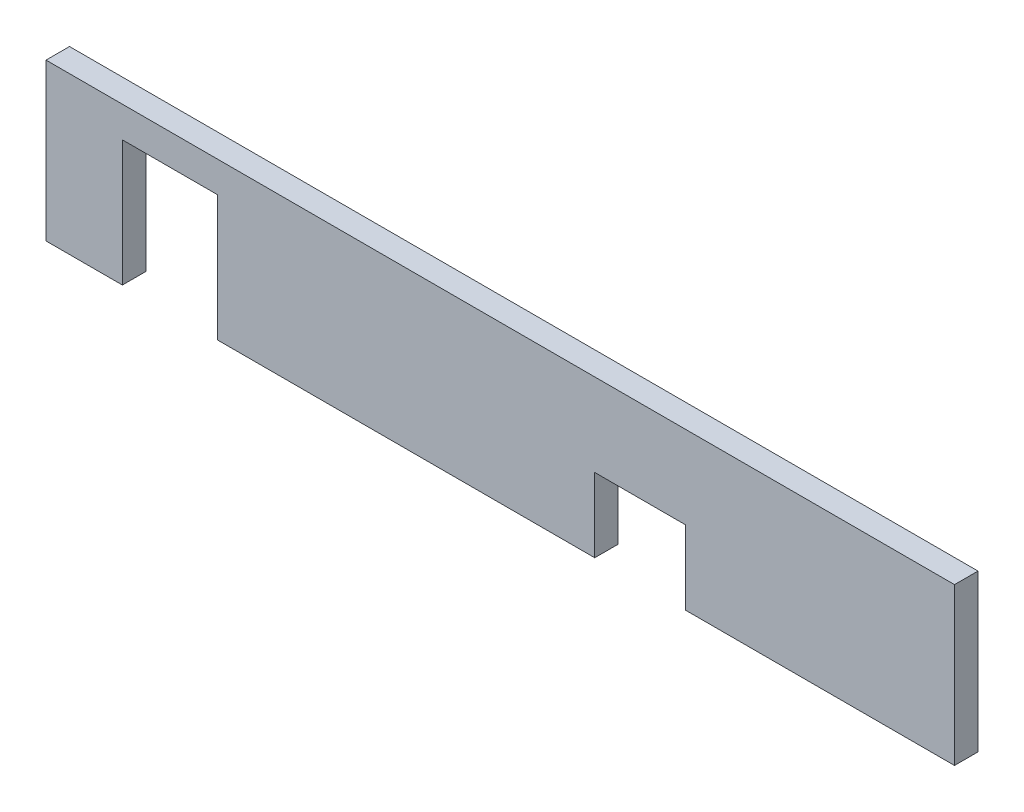
ISO-10303-21;
HEADER;
FILE_DESCRIPTION(('STEP AP214'),'2;1');
FILE_NAME('part.step','',(''),(''),'','','');
FILE_SCHEMA(('AUTOMOTIVE_DESIGN { 1 0 10303 214 1 1 1 1 }'));
ENDSEC;
DATA;
#1=APPLICATION_CONTEXT('core data for automotive mechanical design processes');
#2=APPLICATION_PROTOCOL_DEFINITION('international standard','automotive_design',2000,#1);
#3=PRODUCT_CONTEXT('',#1,'mechanical');
#4=PRODUCT('Part','Part','',(#3));
#5=PRODUCT_RELATED_PRODUCT_CATEGORY('part','',(#4));
#6=PRODUCT_DEFINITION_FORMATION('','',#4);
#7=PRODUCT_DEFINITION_CONTEXT('part definition',#1,'design');
#8=PRODUCT_DEFINITION('design','',#6,#7);
#9=PRODUCT_DEFINITION_SHAPE('','',#8);
#10=(LENGTH_UNIT() NAMED_UNIT(*) SI_UNIT(.MILLI.,.METRE.));
#11=(NAMED_UNIT(*) PLANE_ANGLE_UNIT() SI_UNIT($,.RADIAN.));
#12=(NAMED_UNIT(*) SI_UNIT($,.STERADIAN.) SOLID_ANGLE_UNIT());
#13=UNCERTAINTY_MEASURE_WITH_UNIT(LENGTH_MEASURE(1.E-05),#10,'distance_accuracy_value','');
#14=(GEOMETRIC_REPRESENTATION_CONTEXT(3) GLOBAL_UNCERTAINTY_ASSIGNED_CONTEXT((#13)) GLOBAL_UNIT_ASSIGNED_CONTEXT((#10,
#11,#12)) REPRESENTATION_CONTEXT('',''));
#15=CARTESIAN_POINT('',(0.,0.,0.));
#16=DIRECTION('',(0.,0.,1.));
#17=DIRECTION('',(1.,0.,0.));
#18=AXIS2_PLACEMENT_3D('',#15,#16,#17);
#19=CARTESIAN_POINT('',(0.,0.,3.));
#20=DIRECTION('',(1.,0.,0.));
#21=DIRECTION('',(0.,0.,-1.));
#22=AXIS2_PLACEMENT_3D('',#19,#20,#21);
#23=PLANE('',#22);
#24=DIRECTION('',(0.,-1.,0.));
#25=VECTOR('',#24,1.);
#26=CARTESIAN_POINT('',(0.,0.,0.));
#27=LINE('',#26,#25);
#28=CARTESIAN_POINT('',(0.,20.,0.));
#29=VERTEX_POINT('',#28);
#30=CARTESIAN_POINT('',(0.,0.,0.));
#31=VERTEX_POINT('',#30);
#32=EDGE_CURVE('E153',#29,#31,#27,.T.);
#33=ORIENTED_EDGE('',*,*,#32,.T.);
#34=DIRECTION('',(0.,0.,-1.));
#35=VECTOR('',#34,1.);
#36=CARTESIAN_POINT('',(0.,0.,3.));
#37=LINE('',#36,#35);
#38=CARTESIAN_POINT('',(0.,0.,3.));
#39=VERTEX_POINT('',#38);
#40=EDGE_CURVE('E11',#39,#31,#37,.T.);
#41=ORIENTED_EDGE('',*,*,#40,.F.);
#42=DIRECTION('',(0.,-1.,0.));
#43=VECTOR('',#42,1.);
#44=CARTESIAN_POINT('',(0.,0.,3.));
#45=LINE('',#44,#43);
#46=CARTESIAN_POINT('',(0.,20.,3.));
#47=VERTEX_POINT('',#46);
#48=EDGE_CURVE('E175',#47,#39,#45,.T.);
#49=ORIENTED_EDGE('',*,*,#48,.F.);
#50=DIRECTION('',(0.,0.,-1.));
#51=VECTOR('',#50,1.);
#52=CARTESIAN_POINT('',(0.,20.,3.));
#53=LINE('',#52,#51);
#54=EDGE_CURVE('E149',#47,#29,#53,.T.);
#55=ORIENTED_EDGE('',*,*,#54,.T.);
#56=EDGE_LOOP('',(#33,#41,#49,#55));
#57=FACE_BOUND('',#56,.T.);
#58=ADVANCED_FACE('F33',(#57),#23,.F.);
#59=CARTESIAN_POINT('',(0.,0.,3.));
#60=DIRECTION('',(0.,1.,0.));
#61=DIRECTION('',(0.,0.,1.));
#62=AXIS2_PLACEMENT_3D('',#59,#60,#61);
#63=PLANE('',#62);
#64=DIRECTION('',(1.,0.,0.));
#65=VECTOR('',#64,1.);
#66=CARTESIAN_POINT('',(0.,0.,0.));
#67=LINE('',#66,#65);
#68=CARTESIAN_POINT('',(9.75317906025808,0.,0.));
#69=VERTEX_POINT('',#68);
#70=EDGE_CURVE('E156',#31,#69,#67,.T.);
#71=ORIENTED_EDGE('',*,*,#70,.T.);
#72=DIRECTION('',(0.,0.,-1.));
#73=VECTOR('',#72,1.);
#74=CARTESIAN_POINT('',(9.75317906025808,0.,3.));
#75=LINE('',#74,#73);
#76=CARTESIAN_POINT('',(9.75317906025808,0.,3.));
#77=VERTEX_POINT('',#76);
#78=EDGE_CURVE('E41',#77,#69,#75,.T.);
#79=ORIENTED_EDGE('',*,*,#78,.F.);
#80=DIRECTION('',(1.,0.,0.));
#81=VECTOR('',#80,1.);
#82=CARTESIAN_POINT('',(0.,0.,3.));
#83=LINE('',#82,#81);
#84=EDGE_CURVE('E104',#39,#77,#83,.T.);
#85=ORIENTED_EDGE('',*,*,#84,.F.);
#86=ORIENTED_EDGE('',*,*,#40,.T.);
#87=EDGE_LOOP('',(#71,#79,#85,#86));
#88=FACE_BOUND('',#87,.T.);
#89=ADVANCED_FACE('F253',(#88),#63,.F.);
#90=CARTESIAN_POINT('',(9.75317906025808,0.,3.));
#91=DIRECTION('',(-1.,0.,0.));
#92=DIRECTION('',(0.,0.,1.));
#93=AXIS2_PLACEMENT_3D('',#90,#91,#92);
#94=PLANE('',#93);
#95=DIRECTION('',(0.,1.,0.));
#96=VECTOR('',#95,1.);
#97=CARTESIAN_POINT('',(9.75317906025808,0.,0.));
#98=LINE('',#97,#96);
#99=CARTESIAN_POINT('',(9.75317906025808,16.0609501018403,0.));
#100=VERTEX_POINT('',#99);
#101=EDGE_CURVE('E158',#69,#100,#98,.T.);
#102=ORIENTED_EDGE('',*,*,#101,.T.);
#103=DIRECTION('',(0.,0.,-1.));
#104=VECTOR('',#103,1.);
#105=CARTESIAN_POINT('',(9.75317906025808,16.0609501018403,3.));
#106=LINE('',#105,#104);
#107=CARTESIAN_POINT('',(9.75317906025808,16.0609501018403,3.));
#108=VERTEX_POINT('',#107);
#109=EDGE_CURVE('E194',#108,#100,#106,.T.);
#110=ORIENTED_EDGE('',*,*,#109,.F.);
#111=DIRECTION('',(0.,1.,0.));
#112=VECTOR('',#111,1.);
#113=CARTESIAN_POINT('',(9.75317906025808,0.,3.));
#114=LINE('',#113,#112);
#115=EDGE_CURVE('E202',#77,#108,#114,.T.);
#116=ORIENTED_EDGE('',*,*,#115,.F.);
#117=ORIENTED_EDGE('',*,*,#78,.T.);
#118=EDGE_LOOP('',(#102,#110,#116,#117));
#119=FACE_BOUND('',#118,.T.);
#120=ADVANCED_FACE('F200',(#119),#94,.F.);
#121=CARTESIAN_POINT('',(9.75317906025808,16.0609501018403,3.));
#122=DIRECTION('',(0.,1.,0.));
#123=DIRECTION('',(0.,0.,1.));
#124=AXIS2_PLACEMENT_3D('',#121,#122,#123);
#125=PLANE('',#124);
#126=DIRECTION('',(1.,0.,0.));
#127=VECTOR('',#126,1.);
#128=CARTESIAN_POINT('',(9.75317906025808,16.0609501018403,0.));
#129=LINE('',#128,#127);
#130=CARTESIAN_POINT('',(21.8848327683077,16.0609501018403,0.));
#131=VERTEX_POINT('',#130);
#132=EDGE_CURVE('E160',#100,#131,#129,.T.);
#133=ORIENTED_EDGE('',*,*,#132,.T.);
#134=DIRECTION('',(0.,0.,-1.));
#135=VECTOR('',#134,1.);
#136=CARTESIAN_POINT('',(21.8848327683077,16.0609501018403,3.));
#137=LINE('',#136,#135);
#138=CARTESIAN_POINT('',(21.8848327683077,16.0609501018403,3.));
#139=VERTEX_POINT('',#138);
#140=EDGE_CURVE('E191',#139,#131,#137,.T.);
#141=ORIENTED_EDGE('',*,*,#140,.F.);
#142=DIRECTION('',(1.,0.,0.));
#143=VECTOR('',#142,1.);
#144=CARTESIAN_POINT('',(9.75317906025808,16.0609501018403,3.));
#145=LINE('',#144,#143);
#146=EDGE_CURVE('E220',#108,#139,#145,.T.);
#147=ORIENTED_EDGE('',*,*,#146,.F.);
#148=ORIENTED_EDGE('',*,*,#109,.T.);
#149=EDGE_LOOP('',(#133,#141,#147,#148));
#150=FACE_BOUND('',#149,.T.);
#151=ADVANCED_FACE('F211',(#150),#125,.F.);
#152=CARTESIAN_POINT('',(21.8848327683077,16.0609501018403,3.));
#153=DIRECTION('',(1.,0.,0.));
#154=DIRECTION('',(0.,1.,0.));
#155=AXIS2_PLACEMENT_3D('',#152,#153,#154);
#156=PLANE('',#155);
#157=DIRECTION('',(0.,-1.,0.));
#158=VECTOR('',#157,1.);
#159=CARTESIAN_POINT('',(21.8848327683077,16.0609501018403,0.));
#160=LINE('',#159,#158);
#161=CARTESIAN_POINT('',(21.8848327683077,0.,0.));
#162=VERTEX_POINT('',#161);
#163=EDGE_CURVE('E162',#131,#162,#160,.T.);
#164=ORIENTED_EDGE('',*,*,#163,.T.);
#165=DIRECTION('',(0.,0.,-1.));
#166=VECTOR('',#165,1.);
#167=CARTESIAN_POINT('',(21.8848327683077,0.,3.));
#168=LINE('',#167,#166);
#169=CARTESIAN_POINT('',(21.8848327683077,0.,3.));
#170=VERTEX_POINT('',#169);
#171=EDGE_CURVE('E188',#170,#162,#168,.T.);
#172=ORIENTED_EDGE('',*,*,#171,.F.);
#173=DIRECTION('',(0.,-1.,0.));
#174=VECTOR('',#173,1.);
#175=CARTESIAN_POINT('',(21.8848327683077,16.0609501018403,3.));
#176=LINE('',#175,#174);
#177=EDGE_CURVE('E217',#139,#170,#176,.T.);
#178=ORIENTED_EDGE('',*,*,#177,.F.);
#179=ORIENTED_EDGE('',*,*,#140,.T.);
#180=EDGE_LOOP('',(#164,#172,#178,#179));
#181=FACE_BOUND('',#180,.T.);
#182=ADVANCED_FACE('F215',(#181),#156,.F.);
#183=CARTESIAN_POINT('',(21.8848327683077,0.,3.));
#184=DIRECTION('',(0.,1.,0.));
#185=DIRECTION('',(0.,0.,1.));
#186=AXIS2_PLACEMENT_3D('',#183,#184,#185);
#187=PLANE('',#186);
#188=DIRECTION('',(1.,0.,0.));
#189=VECTOR('',#188,1.);
#190=CARTESIAN_POINT('',(21.8848327683077,0.,0.));
#191=LINE('',#190,#189);
#192=CARTESIAN_POINT('',(70.0646891029635,0.,0.));
#193=VERTEX_POINT('',#192);
#194=EDGE_CURVE('E164',#162,#193,#191,.T.);
#195=ORIENTED_EDGE('',*,*,#194,.T.);
#196=DIRECTION('',(0.,0.,-1.));
#197=VECTOR('',#196,1.);
#198=CARTESIAN_POINT('',(70.0646891029635,0.,3.));
#199=LINE('',#198,#197);
#200=CARTESIAN_POINT('',(70.0646891029635,0.,3.));
#201=VERTEX_POINT('',#200);
#202=EDGE_CURVE('E185',#201,#193,#199,.T.);
#203=ORIENTED_EDGE('',*,*,#202,.F.);
#204=DIRECTION('',(1.,0.,0.));
#205=VECTOR('',#204,1.);
#206=CARTESIAN_POINT('',(21.8848327683077,0.,3.));
#207=LINE('',#206,#205);
#208=EDGE_CURVE('E219',#170,#201,#207,.T.);
#209=ORIENTED_EDGE('',*,*,#208,.F.);
#210=ORIENTED_EDGE('',*,*,#171,.T.);
#211=EDGE_LOOP('',(#195,#203,#209,#210));
#212=FACE_BOUND('',#211,.T.);
#213=ADVANCED_FACE('F266',(#212),#187,.F.);
#214=CARTESIAN_POINT('',(70.0646891029635,0.,3.));
#215=DIRECTION('',(-1.,0.,0.));
#216=DIRECTION('',(0.,0.,1.));
#217=AXIS2_PLACEMENT_3D('',#214,#215,#216);
#218=PLANE('',#217);
#219=DIRECTION('',(0.,1.,0.));
#220=VECTOR('',#219,1.);
#221=CARTESIAN_POINT('',(70.0646891029635,0.,0.));
#222=LINE('',#221,#220);
#223=CARTESIAN_POINT('',(70.0646891029635,9.43656537863546,0.));
#224=VERTEX_POINT('',#223);
#225=EDGE_CURVE('E166',#193,#224,#222,.T.);
#226=ORIENTED_EDGE('',*,*,#225,.T.);
#227=DIRECTION('',(0.,0.,-1.));
#228=VECTOR('',#227,1.);
#229=CARTESIAN_POINT('',(70.0646891029635,9.43656537863546,3.));
#230=LINE('',#229,#228);
#231=CARTESIAN_POINT('',(70.0646891029635,9.43656537863546,3.));
#232=VERTEX_POINT('',#231);
#233=EDGE_CURVE('E182',#232,#224,#230,.T.);
#234=ORIENTED_EDGE('',*,*,#233,.F.);
#235=DIRECTION('',(0.,1.,0.));
#236=VECTOR('',#235,1.);
#237=CARTESIAN_POINT('',(70.0646891029635,0.,3.));
#238=LINE('',#237,#236);
#239=EDGE_CURVE('E222',#201,#232,#238,.T.);
#240=ORIENTED_EDGE('',*,*,#239,.F.);
#241=ORIENTED_EDGE('',*,*,#202,.T.);
#242=EDGE_LOOP('',(#226,#234,#240,#241));
#243=FACE_BOUND('',#242,.T.);
#244=ADVANCED_FACE('F269',(#243),#218,.F.);
#245=CARTESIAN_POINT('',(70.0646891029635,9.43656537863546,3.));
#246=DIRECTION('',(0.,1.,0.));
#247=DIRECTION('',(0.,0.,1.));
#248=AXIS2_PLACEMENT_3D('',#245,#246,#247);
#249=PLANE('',#248);
#250=DIRECTION('',(1.,0.,0.));
#251=VECTOR('',#250,1.);
#252=CARTESIAN_POINT('',(70.0646891029635,9.43656537863546,0.));
#253=LINE('',#252,#251);
#254=CARTESIAN_POINT('',(81.6215854878806,9.43656537863546,0.));
#255=VERTEX_POINT('',#254);
#256=EDGE_CURVE('E168',#224,#255,#253,.T.);
#257=ORIENTED_EDGE('',*,*,#256,.T.);
#258=DIRECTION('',(0.,0.,-1.));
#259=VECTOR('',#258,1.);
#260=CARTESIAN_POINT('',(81.6215854878806,9.43656537863546,3.));
#261=LINE('',#260,#259);
#262=CARTESIAN_POINT('',(81.6215854878806,9.43656537863546,3.));
#263=VERTEX_POINT('',#262);
#264=EDGE_CURVE('E179',#263,#255,#261,.T.);
#265=ORIENTED_EDGE('',*,*,#264,.F.);
#266=DIRECTION('',(1.,0.,0.));
#267=VECTOR('',#266,1.);
#268=CARTESIAN_POINT('',(70.0646891029635,9.43656537863546,3.));
#269=LINE('',#268,#267);
#270=EDGE_CURVE('E228',#232,#263,#269,.T.);
#271=ORIENTED_EDGE('',*,*,#270,.F.);
#272=ORIENTED_EDGE('',*,*,#233,.T.);
#273=EDGE_LOOP('',(#257,#265,#271,#272));
#274=FACE_BOUND('',#273,.T.);
#275=ADVANCED_FACE('F234',(#274),#249,.F.);
#276=CARTESIAN_POINT('',(81.6215854878806,9.43656537863546,3.));
#277=DIRECTION('',(1.,0.,0.));
#278=DIRECTION('',(0.,0.,-1.));
#279=AXIS2_PLACEMENT_3D('',#276,#277,#278);
#280=PLANE('',#279);
#281=DIRECTION('',(0.,-1.,0.));
#282=VECTOR('',#281,1.);
#283=CARTESIAN_POINT('',(81.6215854878806,9.43656537863546,0.));
#284=LINE('',#283,#282);
#285=CARTESIAN_POINT('',(81.6215854878806,0.,0.));
#286=VERTEX_POINT('',#285);
#287=EDGE_CURVE('E170',#255,#286,#284,.T.);
#288=ORIENTED_EDGE('',*,*,#287,.T.);
#289=DIRECTION('',(0.,0.,-1.));
#290=VECTOR('',#289,1.);
#291=CARTESIAN_POINT('',(81.6215854878806,0.,3.));
#292=LINE('',#291,#290);
#293=CARTESIAN_POINT('',(81.6215854878806,0.,3.));
#294=VERTEX_POINT('',#293);
#295=EDGE_CURVE('E144',#294,#286,#292,.T.);
#296=ORIENTED_EDGE('',*,*,#295,.F.);
#297=DIRECTION('',(0.,-1.,0.));
#298=VECTOR('',#297,1.);
#299=CARTESIAN_POINT('',(81.6215854878806,9.43656537863546,3.));
#300=LINE('',#299,#298);
#301=EDGE_CURVE('E135',#263,#294,#300,.T.);
#302=ORIENTED_EDGE('',*,*,#301,.F.);
#303=ORIENTED_EDGE('',*,*,#264,.T.);
#304=EDGE_LOOP('',(#288,#296,#302,#303));
#305=FACE_BOUND('',#304,.T.);
#306=ADVANCED_FACE('F238',(#305),#280,.F.);
#307=CARTESIAN_POINT('',(81.6215854878806,0.,3.));
#308=DIRECTION('',(0.,1.,0.));
#309=DIRECTION('',(0.,0.,1.));
#310=AXIS2_PLACEMENT_3D('',#307,#308,#309);
#311=PLANE('',#310);
#312=DIRECTION('',(1.,0.,0.));
#313=VECTOR('',#312,1.);
#314=CARTESIAN_POINT('',(81.6215854878806,0.,0.));
#315=LINE('',#314,#313);
#316=CARTESIAN_POINT('',(116.,0.,0.));
#317=VERTEX_POINT('',#316);
#318=EDGE_CURVE('E143',#286,#317,#315,.T.);
#319=ORIENTED_EDGE('',*,*,#318,.T.);
#320=DIRECTION('',(0.,0.,-1.));
#321=VECTOR('',#320,1.);
#322=CARTESIAN_POINT('',(116.,0.,3.));
#323=LINE('',#322,#321);
#324=CARTESIAN_POINT('',(116.,0.,3.));
#325=VERTEX_POINT('',#324);
#326=EDGE_CURVE('E140',#325,#317,#323,.T.);
#327=ORIENTED_EDGE('',*,*,#326,.F.);
#328=DIRECTION('',(1.,0.,0.));
#329=VECTOR('',#328,1.);
#330=CARTESIAN_POINT('',(81.6215854878806,0.,3.));
#331=LINE('',#330,#329);
#332=EDGE_CURVE('E129',#294,#325,#331,.T.);
#333=ORIENTED_EDGE('',*,*,#332,.F.);
#334=ORIENTED_EDGE('',*,*,#295,.T.);
#335=EDGE_LOOP('',(#319,#327,#333,#334));
#336=FACE_BOUND('',#335,.T.);
#337=ADVANCED_FACE('F141',(#336),#311,.F.);
#338=CARTESIAN_POINT('',(116.,0.,3.));
#339=DIRECTION('',(-1.,0.,0.));
#340=DIRECTION('',(0.,0.,1.));
#341=AXIS2_PLACEMENT_3D('',#338,#339,#340);
#342=PLANE('',#341);
#343=DIRECTION('',(0.,1.,0.));
#344=VECTOR('',#343,1.);
#345=CARTESIAN_POINT('',(116.,0.,0.));
#346=LINE('',#345,#344);
#347=CARTESIAN_POINT('',(116.,20.,0.));
#348=VERTEX_POINT('',#347);
#349=EDGE_CURVE('E90',#317,#348,#346,.T.);
#350=ORIENTED_EDGE('',*,*,#349,.T.);
#351=DIRECTION('',(0.,0.,-1.));
#352=VECTOR('',#351,1.);
#353=CARTESIAN_POINT('',(116.,20.,3.));
#354=LINE('',#353,#352);
#355=CARTESIAN_POINT('',(116.,20.,3.));
#356=VERTEX_POINT('',#355);
#357=EDGE_CURVE('E145',#356,#348,#354,.T.);
#358=ORIENTED_EDGE('',*,*,#357,.F.);
#359=DIRECTION('',(0.,1.,0.));
#360=VECTOR('',#359,1.);
#361=CARTESIAN_POINT('',(116.,0.,3.));
#362=LINE('',#361,#360);
#363=EDGE_CURVE('E133',#325,#356,#362,.T.);
#364=ORIENTED_EDGE('',*,*,#363,.F.);
#365=ORIENTED_EDGE('',*,*,#326,.T.);
#366=EDGE_LOOP('',(#350,#358,#364,#365));
#367=FACE_BOUND('',#366,.T.);
#368=ADVANCED_FACE('F147',(#367),#342,.F.);
#369=CARTESIAN_POINT('',(0.,20.,3.));
#370=DIRECTION('',(0.,-1.,0.));
#371=DIRECTION('',(0.,0.,-1.));
#372=AXIS2_PLACEMENT_3D('',#369,#370,#371);
#373=PLANE('',#372);
#374=DIRECTION('',(-1.,0.,0.));
#375=VECTOR('',#374,1.);
#376=CARTESIAN_POINT('',(0.,20.,0.));
#377=LINE('',#376,#375);
#378=EDGE_CURVE('E96',#348,#29,#377,.T.);
#379=ORIENTED_EDGE('',*,*,#378,.T.);
#380=ORIENTED_EDGE('',*,*,#54,.F.);
#381=DIRECTION('',(-1.,0.,0.));
#382=VECTOR('',#381,1.);
#383=CARTESIAN_POINT('',(0.,20.,3.));
#384=LINE('',#383,#382);
#385=EDGE_CURVE('E49',#356,#47,#384,.T.);
#386=ORIENTED_EDGE('',*,*,#385,.F.);
#387=ORIENTED_EDGE('',*,*,#357,.T.);
#388=EDGE_LOOP('',(#379,#380,#386,#387));
#389=FACE_BOUND('',#388,.T.);
#390=ADVANCED_FACE('F242',(#389),#373,.F.);
#391=CARTESIAN_POINT('',(0.,0.,3.));
#392=DIRECTION('',(0.,0.,-1.));
#393=DIRECTION('',(-1.,0.,0.));
#394=AXIS2_PLACEMENT_3D('',#391,#392,#393);
#395=PLANE('',#394);
#396=ORIENTED_EDGE('',*,*,#48,.T.);
#397=ORIENTED_EDGE('',*,*,#84,.T.);
#398=ORIENTED_EDGE('',*,*,#115,.T.);
#399=ORIENTED_EDGE('',*,*,#146,.T.);
#400=ORIENTED_EDGE('',*,*,#177,.T.);
#401=ORIENTED_EDGE('',*,*,#208,.T.);
#402=ORIENTED_EDGE('',*,*,#239,.T.);
#403=ORIENTED_EDGE('',*,*,#270,.T.);
#404=ORIENTED_EDGE('',*,*,#301,.T.);
#405=ORIENTED_EDGE('',*,*,#332,.T.);
#406=ORIENTED_EDGE('',*,*,#363,.T.);
#407=ORIENTED_EDGE('',*,*,#385,.T.);
#408=EDGE_LOOP('',(#396,#397,#398,#399,#400,#401,#402,#403,#404,#405,#406,#407));
#409=FACE_BOUND('',#408,.T.);
#410=ADVANCED_FACE('F131',(#409),#395,.F.);
#411=CARTESIAN_POINT('',(0.,0.,0.));
#412=DIRECTION('',(0.,0.,-1.));
#413=DIRECTION('',(-1.,0.,0.));
#414=AXIS2_PLACEMENT_3D('',#411,#412,#413);
#415=PLANE('',#414);
#416=ORIENTED_EDGE('',*,*,#32,.F.);
#417=ORIENTED_EDGE('',*,*,#378,.F.);
#418=ORIENTED_EDGE('',*,*,#349,.F.);
#419=ORIENTED_EDGE('',*,*,#318,.F.);
#420=ORIENTED_EDGE('',*,*,#287,.F.);
#421=ORIENTED_EDGE('',*,*,#256,.F.);
#422=ORIENTED_EDGE('',*,*,#225,.F.);
#423=ORIENTED_EDGE('',*,*,#194,.F.);
#424=ORIENTED_EDGE('',*,*,#163,.F.);
#425=ORIENTED_EDGE('',*,*,#132,.F.);
#426=ORIENTED_EDGE('',*,*,#101,.F.);
#427=ORIENTED_EDGE('',*,*,#70,.F.);
#428=EDGE_LOOP('',(#416,#417,#418,#419,#420,#421,#422,#423,#424,#425,#426,#427));
#429=FACE_BOUND('',#428,.T.);
#430=ADVANCED_FACE('F206',(#429),#415,.T.);
#431=CLOSED_SHELL('',(#58,#89,#120,#151,#182,#213,#244,#275,#306,#337,#368,#390,#410,#430));
#432=MANIFOLD_SOLID_BREP('B2',#431);
#433=ADVANCED_BREP_SHAPE_REPRESENTATION('',(#18,#432),#14);
#434=SHAPE_DEFINITION_REPRESENTATION(#9,#433);
ENDSEC;
END-ISO-10303-21;
